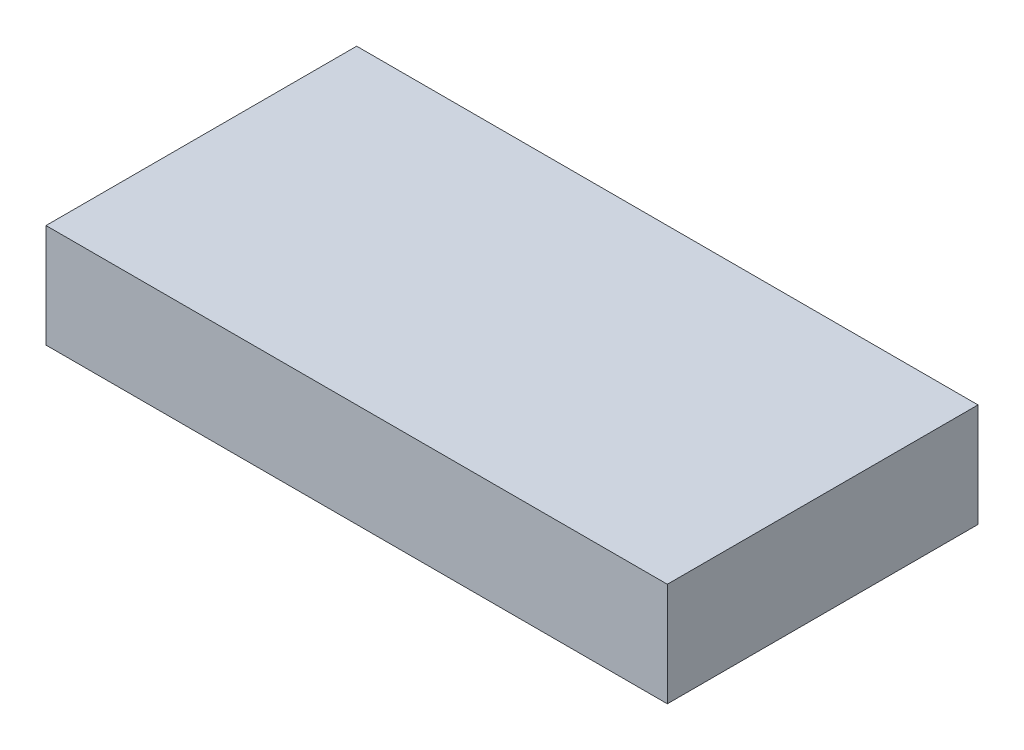
ISO-10303-21;
HEADER;
FILE_DESCRIPTION(('STEP AP214'),'2;1');
FILE_NAME('part.step','',(''),(''),'','','');
FILE_SCHEMA(('AUTOMOTIVE_DESIGN { 1 0 10303 214 1 1 1 1 }'));
ENDSEC;
DATA;
#1=APPLICATION_CONTEXT('core data for automotive mechanical design processes');
#2=APPLICATION_PROTOCOL_DEFINITION('international standard','automotive_design',2000,#1);
#3=PRODUCT_CONTEXT('',#1,'mechanical');
#4=PRODUCT('Part','Part','',(#3));
#5=PRODUCT_RELATED_PRODUCT_CATEGORY('part','',(#4));
#6=PRODUCT_DEFINITION_FORMATION('','',#4);
#7=PRODUCT_DEFINITION_CONTEXT('part definition',#1,'design');
#8=PRODUCT_DEFINITION('design','',#6,#7);
#9=PRODUCT_DEFINITION_SHAPE('','',#8);
#10=(LENGTH_UNIT() NAMED_UNIT(*) SI_UNIT(.MILLI.,.METRE.));
#11=(NAMED_UNIT(*) PLANE_ANGLE_UNIT() SI_UNIT($,.RADIAN.));
#12=(NAMED_UNIT(*) SI_UNIT($,.STERADIAN.) SOLID_ANGLE_UNIT());
#13=UNCERTAINTY_MEASURE_WITH_UNIT(LENGTH_MEASURE(1.E-05),#10,'distance_accuracy_value','');
#14=(GEOMETRIC_REPRESENTATION_CONTEXT(3) GLOBAL_UNCERTAINTY_ASSIGNED_CONTEXT((#13)) GLOBAL_UNIT_ASSIGNED_CONTEXT((#10,
#11,#12)) REPRESENTATION_CONTEXT('',''));
#15=CARTESIAN_POINT('',(0.,0.,0.));
#16=DIRECTION('',(0.,0.,1.));
#17=DIRECTION('',(1.,0.,0.));
#18=AXIS2_PLACEMENT_3D('',#15,#16,#17);
#19=CARTESIAN_POINT('',(12.,4.,-6.));
#20=DIRECTION('',(-1.,0.,0.));
#21=DIRECTION('',(0.,0.,1.));
#22=AXIS2_PLACEMENT_3D('',#19,#20,#21);
#23=PLANE('',#22);
#24=DIRECTION('',(0.,0.,-1.));
#25=VECTOR('',#24,1.);
#26=CARTESIAN_POINT('',(12.,0.,-6.));
#27=LINE('',#26,#25);
#28=CARTESIAN_POINT('',(12.,0.,6.));
#29=VERTEX_POINT('',#28);
#30=CARTESIAN_POINT('',(12.,0.,-6.));
#31=VERTEX_POINT('',#30);
#32=EDGE_CURVE('E96',#29,#31,#27,.T.);
#33=ORIENTED_EDGE('',*,*,#32,.T.);
#34=DIRECTION('',(0.,-1.,0.));
#35=VECTOR('',#34,1.);
#36=CARTESIAN_POINT('',(12.,4.,-6.));
#37=LINE('',#36,#35);
#38=CARTESIAN_POINT('',(12.,4.,-6.));
#39=VERTEX_POINT('',#38);
#40=EDGE_CURVE('E11',#39,#31,#37,.T.);
#41=ORIENTED_EDGE('',*,*,#40,.F.);
#42=DIRECTION('',(0.,0.,-1.));
#43=VECTOR('',#42,1.);
#44=CARTESIAN_POINT('',(12.,4.,-6.));
#45=LINE('',#44,#43);
#46=CARTESIAN_POINT('',(12.,4.,6.));
#47=VERTEX_POINT('',#46);
#48=EDGE_CURVE('E84',#47,#39,#45,.T.);
#49=ORIENTED_EDGE('',*,*,#48,.F.);
#50=DIRECTION('',(0.,-1.,0.));
#51=VECTOR('',#50,1.);
#52=CARTESIAN_POINT('',(12.,4.,6.));
#53=LINE('',#52,#51);
#54=EDGE_CURVE('E92',#47,#29,#53,.T.);
#55=ORIENTED_EDGE('',*,*,#54,.T.);
#56=EDGE_LOOP('',(#33,#41,#49,#55));
#57=FACE_BOUND('',#56,.T.);
#58=ADVANCED_FACE('F33',(#57),#23,.F.);
#59=CARTESIAN_POINT('',(-12.,4.,-6.));
#60=DIRECTION('',(0.,0.,1.));
#61=DIRECTION('',(1.,0.,0.));
#62=AXIS2_PLACEMENT_3D('',#59,#60,#61);
#63=PLANE('',#62);
#64=DIRECTION('',(-1.,0.,0.));
#65=VECTOR('',#64,1.);
#66=CARTESIAN_POINT('',(-12.,0.,-6.));
#67=LINE('',#66,#65);
#68=CARTESIAN_POINT('',(-12.,0.,-6.));
#69=VERTEX_POINT('',#68);
#70=EDGE_CURVE('E88',#31,#69,#67,.T.);
#71=ORIENTED_EDGE('',*,*,#70,.T.);
#72=DIRECTION('',(0.,-1.,0.));
#73=VECTOR('',#72,1.);
#74=CARTESIAN_POINT('',(-12.,4.,-6.));
#75=LINE('',#74,#73);
#76=CARTESIAN_POINT('',(-12.,4.,-6.));
#77=VERTEX_POINT('',#76);
#78=EDGE_CURVE('E41',#77,#69,#75,.T.);
#79=ORIENTED_EDGE('',*,*,#78,.F.);
#80=DIRECTION('',(-1.,0.,0.));
#81=VECTOR('',#80,1.);
#82=CARTESIAN_POINT('',(-12.,4.,-6.));
#83=LINE('',#82,#81);
#84=EDGE_CURVE('E79',#39,#77,#83,.T.);
#85=ORIENTED_EDGE('',*,*,#84,.F.);
#86=ORIENTED_EDGE('',*,*,#40,.T.);
#87=EDGE_LOOP('',(#71,#79,#85,#86));
#88=FACE_BOUND('',#87,.T.);
#89=ADVANCED_FACE('F87',(#88),#63,.F.);
#90=CARTESIAN_POINT('',(-12.,4.,-6.));
#91=DIRECTION('',(1.,0.,0.));
#92=DIRECTION('',(0.,0.,-1.));
#93=AXIS2_PLACEMENT_3D('',#90,#91,#92);
#94=PLANE('',#93);
#95=DIRECTION('',(0.,0.,1.));
#96=VECTOR('',#95,1.);
#97=CARTESIAN_POINT('',(-12.,0.,-6.));
#98=LINE('',#97,#96);
#99=CARTESIAN_POINT('',(-12.,0.,6.));
#100=VERTEX_POINT('',#99);
#101=EDGE_CURVE('E66',#69,#100,#98,.T.);
#102=ORIENTED_EDGE('',*,*,#101,.T.);
#103=DIRECTION('',(0.,-1.,0.));
#104=VECTOR('',#103,1.);
#105=CARTESIAN_POINT('',(-12.,4.,6.));
#106=LINE('',#105,#104);
#107=CARTESIAN_POINT('',(-12.,4.,6.));
#108=VERTEX_POINT('',#107);
#109=EDGE_CURVE('E89',#108,#100,#106,.T.);
#110=ORIENTED_EDGE('',*,*,#109,.F.);
#111=DIRECTION('',(0.,0.,1.));
#112=VECTOR('',#111,1.);
#113=CARTESIAN_POINT('',(-12.,4.,-6.));
#114=LINE('',#113,#112);
#115=EDGE_CURVE('E82',#77,#108,#114,.T.);
#116=ORIENTED_EDGE('',*,*,#115,.F.);
#117=ORIENTED_EDGE('',*,*,#78,.T.);
#118=EDGE_LOOP('',(#102,#110,#116,#117));
#119=FACE_BOUND('',#118,.T.);
#120=ADVANCED_FACE('F90',(#119),#94,.F.);
#121=CARTESIAN_POINT('',(-12.,4.,6.));
#122=DIRECTION('',(0.,0.,-1.));
#123=DIRECTION('',(-1.,0.,0.));
#124=AXIS2_PLACEMENT_3D('',#121,#122,#123);
#125=PLANE('',#124);
#126=DIRECTION('',(1.,0.,0.));
#127=VECTOR('',#126,1.);
#128=CARTESIAN_POINT('',(-12.,0.,6.));
#129=LINE('',#128,#127);
#130=EDGE_CURVE('E72',#100,#29,#129,.T.);
#131=ORIENTED_EDGE('',*,*,#130,.T.);
#132=ORIENTED_EDGE('',*,*,#54,.F.);
#133=DIRECTION('',(1.,0.,0.));
#134=VECTOR('',#133,1.);
#135=CARTESIAN_POINT('',(-12.,4.,6.));
#136=LINE('',#135,#134);
#137=EDGE_CURVE('E49',#108,#47,#136,.T.);
#138=ORIENTED_EDGE('',*,*,#137,.F.);
#139=ORIENTED_EDGE('',*,*,#109,.T.);
#140=EDGE_LOOP('',(#131,#132,#138,#139));
#141=FACE_BOUND('',#140,.T.);
#142=ADVANCED_FACE('F103',(#141),#125,.F.);
#143=CARTESIAN_POINT('',(12.,4.,6.));
#144=DIRECTION('',(0.,1.,0.));
#145=DIRECTION('',(0.,0.,1.));
#146=AXIS2_PLACEMENT_3D('',#143,#144,#145);
#147=PLANE('',#146);
#148=ORIENTED_EDGE('',*,*,#48,.T.);
#149=ORIENTED_EDGE('',*,*,#84,.T.);
#150=ORIENTED_EDGE('',*,*,#115,.T.);
#151=ORIENTED_EDGE('',*,*,#137,.T.);
#152=EDGE_LOOP('',(#148,#149,#150,#151));
#153=FACE_BOUND('',#152,.T.);
#154=ADVANCED_FACE('F80',(#153),#147,.T.);
#155=CARTESIAN_POINT('',(12.,0.,6.));
#156=DIRECTION('',(0.,1.,0.));
#157=DIRECTION('',(0.,0.,1.));
#158=AXIS2_PLACEMENT_3D('',#155,#156,#157);
#159=PLANE('',#158);
#160=ORIENTED_EDGE('',*,*,#32,.F.);
#161=ORIENTED_EDGE('',*,*,#130,.F.);
#162=ORIENTED_EDGE('',*,*,#101,.F.);
#163=ORIENTED_EDGE('',*,*,#70,.F.);
#164=EDGE_LOOP('',(#160,#161,#162,#163));
#165=FACE_BOUND('',#164,.T.);
#166=ADVANCED_FACE('F106',(#165),#159,.F.);
#167=CLOSED_SHELL('',(#58,#89,#120,#142,#154,#166));
#168=MANIFOLD_SOLID_BREP('B2',#167);
#169=ADVANCED_BREP_SHAPE_REPRESENTATION('',(#18,#168),#14);
#170=SHAPE_DEFINITION_REPRESENTATION(#9,#169);
ENDSEC;
END-ISO-10303-21;
